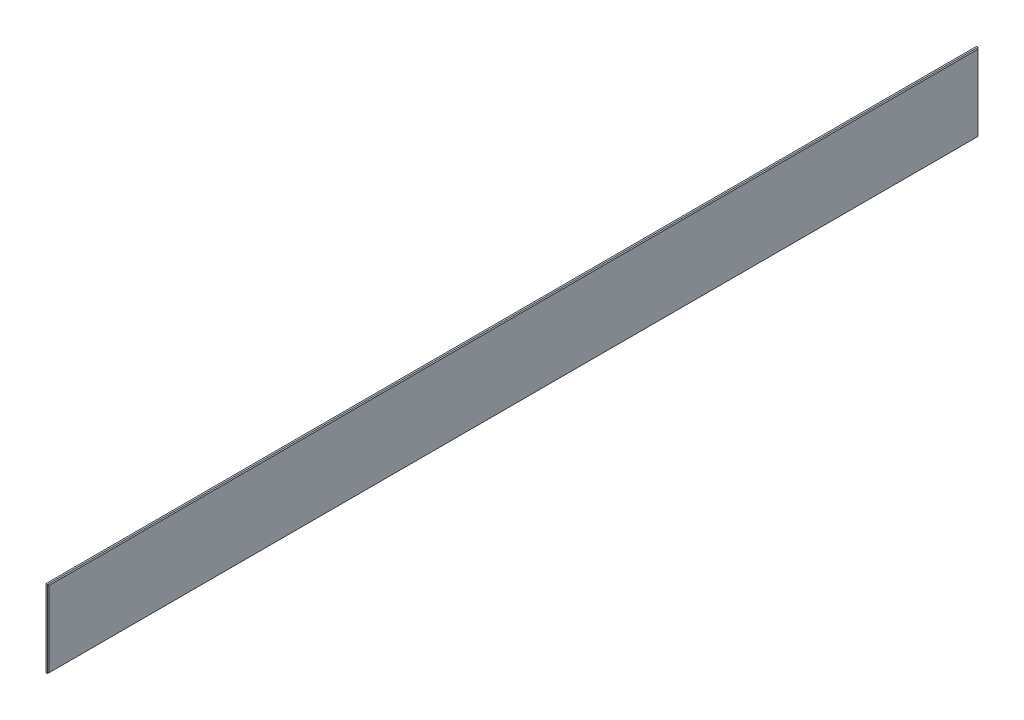
ISO-10303-21;
HEADER;
FILE_DESCRIPTION(('STEP AP214'),'2;1');
FILE_NAME('part.step','',(''),(''),'','','');
FILE_SCHEMA(('AUTOMOTIVE_DESIGN { 1 0 10303 214 1 1 1 1 }'));
ENDSEC;
DATA;
#1=APPLICATION_CONTEXT('core data for automotive mechanical design processes');
#2=APPLICATION_PROTOCOL_DEFINITION('international standard','automotive_design',2000,#1);
#3=PRODUCT_CONTEXT('',#1,'mechanical');
#4=PRODUCT('Part','Part','',(#3));
#5=PRODUCT_RELATED_PRODUCT_CATEGORY('part','',(#4));
#6=PRODUCT_DEFINITION_FORMATION('','',#4);
#7=PRODUCT_DEFINITION_CONTEXT('part definition',#1,'design');
#8=PRODUCT_DEFINITION('design','',#6,#7);
#9=PRODUCT_DEFINITION_SHAPE('','',#8);
#10=(LENGTH_UNIT() NAMED_UNIT(*) SI_UNIT(.MILLI.,.METRE.));
#11=(NAMED_UNIT(*) PLANE_ANGLE_UNIT() SI_UNIT($,.RADIAN.));
#12=(NAMED_UNIT(*) SI_UNIT($,.STERADIAN.) SOLID_ANGLE_UNIT());
#13=UNCERTAINTY_MEASURE_WITH_UNIT(LENGTH_MEASURE(1.E-05),#10,'distance_accuracy_value','');
#14=(GEOMETRIC_REPRESENTATION_CONTEXT(3) GLOBAL_UNCERTAINTY_ASSIGNED_CONTEXT((#13)) GLOBAL_UNIT_ASSIGNED_CONTEXT((#10,
#11,#12)) REPRESENTATION_CONTEXT('',''));
#15=CARTESIAN_POINT('',(0.,0.,0.));
#16=DIRECTION('',(0.,0.,1.));
#17=DIRECTION('',(1.,0.,0.));
#18=AXIS2_PLACEMENT_3D('',#15,#16,#17);
#19=CARTESIAN_POINT('',(823.,-991.,1915.));
#20=DIRECTION('',(1.,0.,0.));
#21=DIRECTION('',(0.,0.,1.));
#22=AXIS2_PLACEMENT_3D('',#19,#20,#21);
#23=PLANE('',#22);
#24=DIRECTION('',(0.,-1.,0.));
#25=VECTOR('',#24,1.);
#26=CARTESIAN_POINT('',(823.,-175.7,1732.3));
#27=LINE('',#26,#25);
#28=CARTESIAN_POINT('',(823.,-175.7,1732.3));
#29=VERTEX_POINT('',#28);
#30=CARTESIAN_POINT('',(823.,-239.3,1732.3));
#31=VERTEX_POINT('',#30);
#32=EDGE_CURVE('E11',#29,#31,#27,.T.);
#33=ORIENTED_EDGE('',*,*,#32,.T.);
#34=DIRECTION('',(0.,0.,-1.));
#35=VECTOR('',#34,1.);
#36=CARTESIAN_POINT('',(823.,-239.3,1732.3));
#37=LINE('',#36,#35);
#38=CARTESIAN_POINT('',(823.,-239.3,950.7));
#39=VERTEX_POINT('',#38);
#40=EDGE_CURVE('E27',#31,#39,#37,.T.);
#41=ORIENTED_EDGE('',*,*,#40,.T.);
#42=DIRECTION('',(0.,1.,0.));
#43=VECTOR('',#42,1.);
#44=CARTESIAN_POINT('',(823.,-239.3,950.7));
#45=LINE('',#44,#43);
#46=CARTESIAN_POINT('',(823.,-175.7,950.7));
#47=VERTEX_POINT('',#46);
#48=EDGE_CURVE('E100',#39,#47,#45,.T.);
#49=ORIENTED_EDGE('',*,*,#48,.T.);
#50=DIRECTION('',(0.,0.,1.));
#51=VECTOR('',#50,1.);
#52=CARTESIAN_POINT('',(823.,-175.7,950.7));
#53=LINE('',#52,#51);
#54=EDGE_CURVE('E103',#47,#29,#53,.T.);
#55=ORIENTED_EDGE('',*,*,#54,.T.);
#56=EDGE_LOOP('',(#33,#41,#49,#55));
#57=FACE_BOUND('',#56,.T.);
#58=ADVANCED_FACE('F17',(#57),#23,.T.);
#59=CARTESIAN_POINT('',(822.65,-175.35,1341.5));
#60=DIRECTION('',(0.707106781186598,0.707106781186498,0.));
#61=DIRECTION('',(0.,0.,-1.));
#62=AXIS2_PLACEMENT_3D('',#59,#60,#61);
#63=PLANE('',#62);
#64=DIRECTION('',(0.577350269189592,-0.577350269189693,-0.577350269189592));
#65=VECTOR('',#64,1.);
#66=CARTESIAN_POINT('',(822.3,-175.,1733.));
#67=LINE('',#66,#65);
#68=CARTESIAN_POINT('',(822.3,-175.,1733.));
#69=VERTEX_POINT('',#68);
#70=EDGE_CURVE('E105',#69,#29,#67,.T.);
#71=ORIENTED_EDGE('',*,*,#70,.T.);
#72=ORIENTED_EDGE('',*,*,#54,.F.);
#73=DIRECTION('',(0.577350269189592,-0.577350269189592,0.577350269189693));
#74=VECTOR('',#73,1.);
#75=CARTESIAN_POINT('',(822.3,-175.,950.));
#76=LINE('',#75,#74);
#77=CARTESIAN_POINT('',(822.3,-175.,950.));
#78=VERTEX_POINT('',#77);
#79=EDGE_CURVE('E119',#78,#47,#76,.T.);
#80=ORIENTED_EDGE('',*,*,#79,.F.);
#81=DIRECTION('',(0.,0.,1.));
#82=VECTOR('',#81,1.);
#83=CARTESIAN_POINT('',(822.3,-175.,950.));
#84=LINE('',#83,#82);
#85=EDGE_CURVE('E106',#78,#69,#84,.T.);
#86=ORIENTED_EDGE('',*,*,#85,.T.);
#87=EDGE_LOOP('',(#71,#72,#80,#86));
#88=FACE_BOUND('',#87,.T.);
#89=ADVANCED_FACE('F136',(#88),#63,.T.);
#90=CARTESIAN_POINT('',(823.,-175.,950.));
#91=DIRECTION('',(0.,1.,0.));
#92=DIRECTION('',(0.,0.,-1.));
#93=AXIS2_PLACEMENT_3D('',#90,#91,#92);
#94=PLANE('',#93);
#95=DIRECTION('',(-1.,0.,0.));
#96=VECTOR('',#95,1.);
#97=CARTESIAN_POINT('',(822.3,-175.,950.));
#98=LINE('',#97,#96);
#99=CARTESIAN_POINT('',(821.,-175.,950.));
#100=VERTEX_POINT('',#99);
#101=EDGE_CURVE('E97',#78,#100,#98,.T.);
#102=ORIENTED_EDGE('',*,*,#101,.T.);
#103=DIRECTION('',(0.,0.,1.));
#104=VECTOR('',#103,1.);
#105=CARTESIAN_POINT('',(821.,-175.,950.));
#106=LINE('',#105,#104);
#107=CARTESIAN_POINT('',(821.,-175.,1733.));
#108=VERTEX_POINT('',#107);
#109=EDGE_CURVE('E102',#100,#108,#106,.T.);
#110=ORIENTED_EDGE('',*,*,#109,.T.);
#111=DIRECTION('',(-1.,0.,0.));
#112=VECTOR('',#111,1.);
#113=CARTESIAN_POINT('',(822.3,-175.,1733.));
#114=LINE('',#113,#112);
#115=EDGE_CURVE('E75',#69,#108,#114,.T.);
#116=ORIENTED_EDGE('',*,*,#115,.F.);
#117=ORIENTED_EDGE('',*,*,#85,.F.);
#118=EDGE_LOOP('',(#102,#110,#116,#117));
#119=FACE_BOUND('',#118,.T.);
#120=ADVANCED_FACE('F133',(#119),#94,.T.);
#121=CARTESIAN_POINT('',(823.,-175.,1733.));
#122=DIRECTION('',(0.,0.,1.));
#123=DIRECTION('',(1.,0.,0.));
#124=AXIS2_PLACEMENT_3D('',#121,#122,#123);
#125=PLANE('',#124);
#126=ORIENTED_EDGE('',*,*,#115,.T.);
#127=DIRECTION('',(0.,-1.,0.));
#128=VECTOR('',#127,1.);
#129=CARTESIAN_POINT('',(821.,-175.,1733.));
#130=LINE('',#129,#128);
#131=CARTESIAN_POINT('',(821.,-240.,1733.));
#132=VERTEX_POINT('',#131);
#133=EDGE_CURVE('E89',#108,#132,#130,.T.);
#134=ORIENTED_EDGE('',*,*,#133,.T.);
#135=DIRECTION('',(-1.,0.,0.));
#136=VECTOR('',#135,1.);
#137=CARTESIAN_POINT('',(822.3,-240.,1733.));
#138=LINE('',#137,#136);
#139=CARTESIAN_POINT('',(822.3,-240.,1733.));
#140=VERTEX_POINT('',#139);
#141=EDGE_CURVE('E81',#140,#132,#138,.T.);
#142=ORIENTED_EDGE('',*,*,#141,.F.);
#143=DIRECTION('',(0.,-1.,0.));
#144=VECTOR('',#143,1.);
#145=CARTESIAN_POINT('',(822.3,-175.,1733.));
#146=LINE('',#145,#144);
#147=EDGE_CURVE('E112',#69,#140,#146,.T.);
#148=ORIENTED_EDGE('',*,*,#147,.F.);
#149=EDGE_LOOP('',(#126,#134,#142,#148));
#150=FACE_BOUND('',#149,.T.);
#151=ADVANCED_FACE('F90',(#150),#125,.T.);
#152=CARTESIAN_POINT('',(822.65,-207.5,1732.65));
#153=DIRECTION('',(0.707106781186498,0.,0.707106781186598));
#154=DIRECTION('',(0.,1.,0.));
#155=AXIS2_PLACEMENT_3D('',#152,#153,#154);
#156=PLANE('',#155);
#157=DIRECTION('',(0.577350269189626,0.577350269189626,-0.577350269189626));
#158=VECTOR('',#157,1.);
#159=CARTESIAN_POINT('',(822.3,-240.,1733.));
#160=LINE('',#159,#158);
#161=EDGE_CURVE('E91',#140,#31,#160,.T.);
#162=ORIENTED_EDGE('',*,*,#161,.T.);
#163=ORIENTED_EDGE('',*,*,#32,.F.);
#164=ORIENTED_EDGE('',*,*,#70,.F.);
#165=ORIENTED_EDGE('',*,*,#147,.T.);
#166=EDGE_LOOP('',(#162,#163,#164,#165));
#167=FACE_BOUND('',#166,.T.);
#168=ADVANCED_FACE('F138',(#167),#156,.T.);
#169=CARTESIAN_POINT('',(822.65,-239.65,1341.5));
#170=DIRECTION('',(0.707106781186598,-0.707106781186498,0.));
#171=DIRECTION('',(0.,0.,-1.));
#172=AXIS2_PLACEMENT_3D('',#169,#170,#171);
#173=PLANE('',#172);
#174=ORIENTED_EDGE('',*,*,#161,.F.);
#175=DIRECTION('',(0.,0.,-1.));
#176=VECTOR('',#175,1.);
#177=CARTESIAN_POINT('',(822.3,-240.,1733.));
#178=LINE('',#177,#176);
#179=CARTESIAN_POINT('',(822.3,-240.,950.));
#180=VERTEX_POINT('',#179);
#181=EDGE_CURVE('E86',#140,#180,#178,.T.);
#182=ORIENTED_EDGE('',*,*,#181,.T.);
#183=DIRECTION('',(0.577350269189592,0.577350269189592,0.577350269189693));
#184=VECTOR('',#183,1.);
#185=CARTESIAN_POINT('',(822.3,-240.,950.));
#186=LINE('',#185,#184);
#187=EDGE_CURVE('E122',#180,#39,#186,.T.);
#188=ORIENTED_EDGE('',*,*,#187,.T.);
#189=ORIENTED_EDGE('',*,*,#40,.F.);
#190=EDGE_LOOP('',(#174,#182,#188,#189));
#191=FACE_BOUND('',#190,.T.);
#192=ADVANCED_FACE('F19',(#191),#173,.T.);
#193=CARTESIAN_POINT('',(822.65,-207.5,950.35));
#194=DIRECTION('',(0.707106781186598,0.,-0.707106781186498));
#195=DIRECTION('',(0.,1.,0.));
#196=AXIS2_PLACEMENT_3D('',#193,#194,#195);
#197=PLANE('',#196);
#198=ORIENTED_EDGE('',*,*,#79,.T.);
#199=ORIENTED_EDGE('',*,*,#48,.F.);
#200=ORIENTED_EDGE('',*,*,#187,.F.);
#201=DIRECTION('',(0.,1.,0.));
#202=VECTOR('',#201,1.);
#203=CARTESIAN_POINT('',(822.3,-240.,950.));
#204=LINE('',#203,#202);
#205=EDGE_CURVE('E21',#180,#78,#204,.T.);
#206=ORIENTED_EDGE('',*,*,#205,.T.);
#207=EDGE_LOOP('',(#198,#199,#200,#206));
#208=FACE_BOUND('',#207,.T.);
#209=ADVANCED_FACE('F120',(#208),#197,.T.);
#210=CARTESIAN_POINT('',(823.,-240.,950.));
#211=DIRECTION('',(0.,0.,-1.));
#212=DIRECTION('',(0.,1.,0.));
#213=AXIS2_PLACEMENT_3D('',#210,#211,#212);
#214=PLANE('',#213);
#215=DIRECTION('',(-1.,0.,0.));
#216=VECTOR('',#215,1.);
#217=CARTESIAN_POINT('',(822.3,-240.,950.));
#218=LINE('',#217,#216);
#219=CARTESIAN_POINT('',(821.,-240.,950.));
#220=VERTEX_POINT('',#219);
#221=EDGE_CURVE('E124',#180,#220,#218,.T.);
#222=ORIENTED_EDGE('',*,*,#221,.T.);
#223=DIRECTION('',(0.,1.,0.));
#224=VECTOR('',#223,1.);
#225=CARTESIAN_POINT('',(821.,-240.,950.));
#226=LINE('',#225,#224);
#227=EDGE_CURVE('E61',#220,#100,#226,.T.);
#228=ORIENTED_EDGE('',*,*,#227,.T.);
#229=ORIENTED_EDGE('',*,*,#101,.F.);
#230=ORIENTED_EDGE('',*,*,#205,.F.);
#231=EDGE_LOOP('',(#222,#228,#229,#230));
#232=FACE_BOUND('',#231,.T.);
#233=ADVANCED_FACE('F129',(#232),#214,.T.);
#234=CARTESIAN_POINT('',(821.,-991.,1915.));
#235=DIRECTION('',(1.,0.,0.));
#236=DIRECTION('',(0.,0.,1.));
#237=AXIS2_PLACEMENT_3D('',#234,#235,#236);
#238=PLANE('',#237);
#239=DIRECTION('',(0.,0.,-1.));
#240=VECTOR('',#239,1.);
#241=CARTESIAN_POINT('',(821.,-240.,1733.));
#242=LINE('',#241,#240);
#243=EDGE_CURVE('E84',#132,#220,#242,.T.);
#244=ORIENTED_EDGE('',*,*,#243,.F.);
#245=ORIENTED_EDGE('',*,*,#133,.F.);
#246=ORIENTED_EDGE('',*,*,#109,.F.);
#247=ORIENTED_EDGE('',*,*,#227,.F.);
#248=EDGE_LOOP('',(#244,#245,#246,#247));
#249=FACE_BOUND('',#248,.T.);
#250=ADVANCED_FACE('F93',(#249),#238,.F.);
#251=CARTESIAN_POINT('',(823.,-240.,1733.));
#252=DIRECTION('',(0.,-1.,0.));
#253=DIRECTION('',(1.,0.,0.));
#254=AXIS2_PLACEMENT_3D('',#251,#252,#253);
#255=PLANE('',#254);
#256=ORIENTED_EDGE('',*,*,#141,.T.);
#257=ORIENTED_EDGE('',*,*,#243,.T.);
#258=ORIENTED_EDGE('',*,*,#221,.F.);
#259=ORIENTED_EDGE('',*,*,#181,.F.);
#260=EDGE_LOOP('',(#256,#257,#258,#259));
#261=FACE_BOUND('',#260,.T.);
#262=ADVANCED_FACE('F82',(#261),#255,.T.);
#263=CLOSED_SHELL('',(#58,#89,#120,#151,#168,#192,#209,#233,#250,#262));
#264=MANIFOLD_SOLID_BREP('B1',#263);
#265=ADVANCED_BREP_SHAPE_REPRESENTATION('',(#18,#264),#14);
#266=SHAPE_DEFINITION_REPRESENTATION(#9,#265);
ENDSEC;
END-ISO-10303-21;
